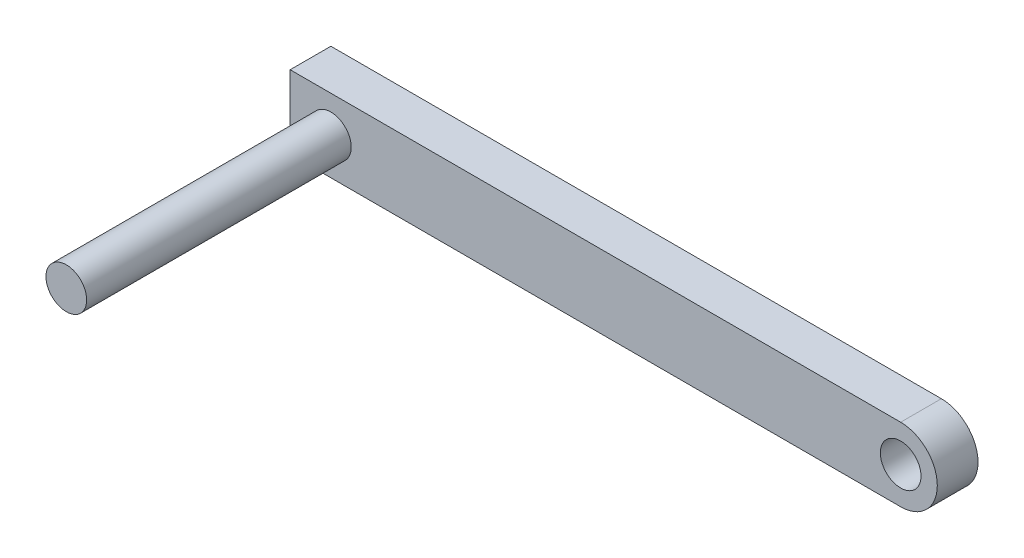
ISO-10303-21;
HEADER;
FILE_DESCRIPTION(('STEP AP214'),'2;1');
FILE_NAME('part.step','',(''),(''),'','','');
FILE_SCHEMA(('AUTOMOTIVE_DESIGN { 1 0 10303 214 1 1 1 1 }'));
ENDSEC;
DATA;
#1=APPLICATION_CONTEXT('core data for automotive mechanical design processes');
#2=APPLICATION_PROTOCOL_DEFINITION('international standard','automotive_design',2000,#1);
#3=PRODUCT_CONTEXT('',#1,'mechanical');
#4=PRODUCT('Part','Part','',(#3));
#5=PRODUCT_RELATED_PRODUCT_CATEGORY('part','',(#4));
#6=PRODUCT_DEFINITION_FORMATION('','',#4);
#7=PRODUCT_DEFINITION_CONTEXT('part definition',#1,'design');
#8=PRODUCT_DEFINITION('design','',#6,#7);
#9=PRODUCT_DEFINITION_SHAPE('','',#8);
#10=(LENGTH_UNIT() NAMED_UNIT(*) SI_UNIT(.MILLI.,.METRE.));
#11=(NAMED_UNIT(*) PLANE_ANGLE_UNIT() SI_UNIT($,.RADIAN.));
#12=(NAMED_UNIT(*) SI_UNIT($,.STERADIAN.) SOLID_ANGLE_UNIT());
#13=UNCERTAINTY_MEASURE_WITH_UNIT(LENGTH_MEASURE(1.E-05),#10,'distance_accuracy_value','');
#14=(GEOMETRIC_REPRESENTATION_CONTEXT(3) GLOBAL_UNCERTAINTY_ASSIGNED_CONTEXT((#13)) GLOBAL_UNIT_ASSIGNED_CONTEXT((#10,
#11,#12)) REPRESENTATION_CONTEXT('',''));
#15=CARTESIAN_POINT('',(0.,0.,0.));
#16=DIRECTION('',(0.,0.,1.));
#17=DIRECTION('',(1.,0.,0.));
#18=AXIS2_PLACEMENT_3D('',#15,#16,#17);
#19=CARTESIAN_POINT('',(300.,18.,20.));
#20=DIRECTION('',(0.,0.,1.));
#21=DIRECTION('',(1.,0.,0.));
#22=AXIS2_PLACEMENT_3D('',#19,#20,#21);
#23=PLANE('',#22);
#24=CARTESIAN_POINT('',(300.,18.,20.));
#25=DIRECTION('',(0.,0.,1.));
#26=DIRECTION('',(1.,0.,0.));
#27=AXIS2_PLACEMENT_3D('',#24,#25,#26);
#28=CIRCLE('',#27,10.);
#29=CARTESIAN_POINT('',(310.,18.,20.));
#30=VERTEX_POINT('',#29);
#31=EDGE_CURVE('E99',#30,#30,#28,.T.);
#32=ORIENTED_EDGE('',*,*,#31,.F.);
#33=EDGE_LOOP('',(#32));
#34=FACE_BOUND('',#33,.T.);
#35=DIRECTION('',(0.,-1.,0.));
#36=VECTOR('',#35,1.);
#37=CARTESIAN_POINT('',(0.,36.,20.));
#38=LINE('',#37,#36);
#39=CARTESIAN_POINT('',(0.,36.,20.));
#40=VERTEX_POINT('',#39);
#41=CARTESIAN_POINT('',(0.,0.,20.));
#42=VERTEX_POINT('',#41);
#43=EDGE_CURVE('E84',#40,#42,#38,.T.);
#44=ORIENTED_EDGE('',*,*,#43,.T.);
#45=DIRECTION('',(1.,0.,0.));
#46=VECTOR('',#45,1.);
#47=CARTESIAN_POINT('',(0.,0.,20.));
#48=LINE('',#47,#46);
#49=CARTESIAN_POINT('',(300.,0.,20.));
#50=VERTEX_POINT('',#49);
#51=EDGE_CURVE('E79',#42,#50,#48,.T.);
#52=ORIENTED_EDGE('',*,*,#51,.T.);
#53=CARTESIAN_POINT('',(300.,18.,20.));
#54=DIRECTION('',(0.,0.,1.));
#55=DIRECTION('',(1.,0.,0.));
#56=AXIS2_PLACEMENT_3D('',#53,#54,#55);
#57=CIRCLE('',#56,18.);
#58=CARTESIAN_POINT('',(300.,36.,20.));
#59=VERTEX_POINT('',#58);
#60=EDGE_CURVE('E82',#50,#59,#57,.T.);
#61=ORIENTED_EDGE('',*,*,#60,.T.);
#62=DIRECTION('',(-1.,0.,0.));
#63=VECTOR('',#62,1.);
#64=CARTESIAN_POINT('',(300.,36.,20.));
#65=LINE('',#64,#63);
#66=EDGE_CURVE('E49',#59,#40,#65,.T.);
#67=ORIENTED_EDGE('',*,*,#66,.T.);
#68=EDGE_LOOP('',(#44,#52,#61,#67));
#69=FACE_BOUND('',#68,.T.);
#70=CARTESIAN_POINT('',(20.,18.,20.));
#71=DIRECTION('',(0.,0.,1.));
#72=DIRECTION('',(1.,0.,0.));
#73=AXIS2_PLACEMENT_3D('',#70,#71,#72);
#74=CIRCLE('',#73,10.);
#75=CARTESIAN_POINT('',(30.,18.,20.));
#76=VERTEX_POINT('',#75);
#77=EDGE_CURVE('E117',#76,#76,#74,.T.);
#78=ORIENTED_EDGE('',*,*,#77,.F.);
#79=EDGE_LOOP('',(#78));
#80=FACE_BOUND('',#79,.T.);
#81=ADVANCED_FACE('F32',(#34,#69,#80),#23,.T.);
#82=CARTESIAN_POINT('',(300.,18.,0.));
#83=DIRECTION('',(0.,0.,1.));
#84=DIRECTION('',(1.,0.,0.));
#85=AXIS2_PLACEMENT_3D('',#82,#83,#84);
#86=PLANE('',#85);
#87=DIRECTION('',(0.,-1.,0.));
#88=VECTOR('',#87,1.);
#89=CARTESIAN_POINT('',(0.,36.,0.));
#90=LINE('',#89,#88);
#91=CARTESIAN_POINT('',(0.,36.,0.));
#92=VERTEX_POINT('',#91);
#93=CARTESIAN_POINT('',(0.,0.,0.));
#94=VERTEX_POINT('',#93);
#95=EDGE_CURVE('E96',#92,#94,#90,.T.);
#96=ORIENTED_EDGE('',*,*,#95,.F.);
#97=DIRECTION('',(-1.,0.,0.));
#98=VECTOR('',#97,1.);
#99=CARTESIAN_POINT('',(300.,36.,0.));
#100=LINE('',#99,#98);
#101=CARTESIAN_POINT('',(300.,36.,0.));
#102=VERTEX_POINT('',#101);
#103=EDGE_CURVE('E72',#102,#92,#100,.T.);
#104=ORIENTED_EDGE('',*,*,#103,.F.);
#105=CARTESIAN_POINT('',(300.,18.,0.));
#106=DIRECTION('',(0.,0.,1.));
#107=DIRECTION('',(1.,0.,0.));
#108=AXIS2_PLACEMENT_3D('',#105,#106,#107);
#109=CIRCLE('',#108,18.);
#110=CARTESIAN_POINT('',(300.,0.,0.));
#111=VERTEX_POINT('',#110);
#112=EDGE_CURVE('E66',#111,#102,#109,.T.);
#113=ORIENTED_EDGE('',*,*,#112,.F.);
#114=DIRECTION('',(1.,0.,0.));
#115=VECTOR('',#114,1.);
#116=CARTESIAN_POINT('',(0.,0.,0.));
#117=LINE('',#116,#115);
#118=EDGE_CURVE('E88',#94,#111,#117,.T.);
#119=ORIENTED_EDGE('',*,*,#118,.F.);
#120=EDGE_LOOP('',(#96,#104,#113,#119));
#121=FACE_BOUND('',#120,.T.);
#122=CARTESIAN_POINT('',(300.,18.,0.));
#123=DIRECTION('',(0.,0.,1.));
#124=DIRECTION('',(1.,0.,0.));
#125=AXIS2_PLACEMENT_3D('',#122,#123,#124);
#126=CIRCLE('',#125,10.);
#127=CARTESIAN_POINT('',(310.,18.,0.));
#128=VERTEX_POINT('',#127);
#129=EDGE_CURVE('E111',#128,#128,#126,.T.);
#130=ORIENTED_EDGE('',*,*,#129,.T.);
#131=EDGE_LOOP('',(#130));
#132=FACE_BOUND('',#131,.T.);
#133=ADVANCED_FACE('F107',(#121,#132),#86,.F.);
#134=CARTESIAN_POINT('',(0.,36.,20.));
#135=DIRECTION('',(1.,0.,0.));
#136=DIRECTION('',(0.,1.,0.));
#137=AXIS2_PLACEMENT_3D('',#134,#135,#136);
#138=PLANE('',#137);
#139=ORIENTED_EDGE('',*,*,#95,.T.);
#140=DIRECTION('',(0.,0.,-1.));
#141=VECTOR('',#140,1.);
#142=CARTESIAN_POINT('',(0.,0.,20.));
#143=LINE('',#142,#141);
#144=EDGE_CURVE('E11',#42,#94,#143,.T.);
#145=ORIENTED_EDGE('',*,*,#144,.F.);
#146=ORIENTED_EDGE('',*,*,#43,.F.);
#147=DIRECTION('',(0.,0.,-1.));
#148=VECTOR('',#147,1.);
#149=CARTESIAN_POINT('',(0.,36.,20.));
#150=LINE('',#149,#148);
#151=EDGE_CURVE('E92',#40,#92,#150,.T.);
#152=ORIENTED_EDGE('',*,*,#151,.T.);
#153=EDGE_LOOP('',(#139,#145,#146,#152));
#154=FACE_BOUND('',#153,.T.);
#155=ADVANCED_FACE('F34',(#154),#138,.F.);
#156=CARTESIAN_POINT('',(0.,0.,20.));
#157=DIRECTION('',(0.,1.,0.));
#158=DIRECTION('',(0.,0.,1.));
#159=AXIS2_PLACEMENT_3D('',#156,#157,#158);
#160=PLANE('',#159);
#161=ORIENTED_EDGE('',*,*,#118,.T.);
#162=DIRECTION('',(0.,0.,-1.));
#163=VECTOR('',#162,1.);
#164=CARTESIAN_POINT('',(300.,0.,20.));
#165=LINE('',#164,#163);
#166=EDGE_CURVE('E41',#50,#111,#165,.T.);
#167=ORIENTED_EDGE('',*,*,#166,.F.);
#168=ORIENTED_EDGE('',*,*,#51,.F.);
#169=ORIENTED_EDGE('',*,*,#144,.T.);
#170=EDGE_LOOP('',(#161,#167,#168,#169));
#171=FACE_BOUND('',#170,.T.);
#172=ADVANCED_FACE('F87',(#171),#160,.F.);
#173=CARTESIAN_POINT('',(300.,18.,20.));
#174=DIRECTION('',(0.,0.,-1.));
#175=DIRECTION('',(-1.,0.,0.));
#176=AXIS2_PLACEMENT_3D('',#173,#174,#175);
#177=CYLINDRICAL_SURFACE('',#176,18.);
#178=ORIENTED_EDGE('',*,*,#112,.T.);
#179=DIRECTION('',(0.,0.,-1.));
#180=VECTOR('',#179,1.);
#181=CARTESIAN_POINT('',(300.,36.,20.));
#182=LINE('',#181,#180);
#183=EDGE_CURVE('E89',#59,#102,#182,.T.);
#184=ORIENTED_EDGE('',*,*,#183,.F.);
#185=ORIENTED_EDGE('',*,*,#60,.F.);
#186=ORIENTED_EDGE('',*,*,#166,.T.);
#187=EDGE_LOOP('',(#178,#184,#185,#186));
#188=FACE_BOUND('',#187,.T.);
#189=ADVANCED_FACE('F90',(#188),#177,.T.);
#190=CARTESIAN_POINT('',(300.,36.,20.));
#191=DIRECTION('',(0.,-1.,0.));
#192=DIRECTION('',(1.,0.,0.));
#193=AXIS2_PLACEMENT_3D('',#190,#191,#192);
#194=PLANE('',#193);
#195=ORIENTED_EDGE('',*,*,#103,.T.);
#196=ORIENTED_EDGE('',*,*,#151,.F.);
#197=ORIENTED_EDGE('',*,*,#66,.F.);
#198=ORIENTED_EDGE('',*,*,#183,.T.);
#199=EDGE_LOOP('',(#195,#196,#197,#198));
#200=FACE_BOUND('',#199,.T.);
#201=ADVANCED_FACE('F104',(#200),#194,.F.);
#202=CARTESIAN_POINT('',(300.,18.,20.));
#203=DIRECTION('',(0.,0.,-1.));
#204=DIRECTION('',(-1.,0.,0.));
#205=AXIS2_PLACEMENT_3D('',#202,#203,#204);
#206=CYLINDRICAL_SURFACE('',#205,10.);
#207=ORIENTED_EDGE('',*,*,#31,.T.);
#208=EDGE_LOOP('',(#207));
#209=FACE_BOUND('',#208,.T.);
#210=ORIENTED_EDGE('',*,*,#129,.F.);
#211=EDGE_LOOP('',(#210));
#212=FACE_BOUND('',#211,.T.);
#213=ADVANCED_FACE('F128',(#209,#212),#206,.F.);
#214=CARTESIAN_POINT('',(20.,18.,150.));
#215=DIRECTION('',(0.,0.,-1.));
#216=DIRECTION('',(-1.,0.,0.));
#217=AXIS2_PLACEMENT_3D('',#214,#215,#216);
#218=CYLINDRICAL_SURFACE('',#217,10.);
#219=CARTESIAN_POINT('',(20.,18.,150.));
#220=DIRECTION('',(0.,0.,1.));
#221=DIRECTION('',(1.,0.,0.));
#222=AXIS2_PLACEMENT_3D('',#219,#220,#221);
#223=CIRCLE('',#222,10.);
#224=CARTESIAN_POINT('',(30.,18.,150.));
#225=VERTEX_POINT('',#224);
#226=EDGE_CURVE('E114',#225,#225,#223,.T.);
#227=ORIENTED_EDGE('',*,*,#226,.F.);
#228=EDGE_LOOP('',(#227));
#229=FACE_BOUND('',#228,.T.);
#230=ORIENTED_EDGE('',*,*,#77,.T.);
#231=EDGE_LOOP('',(#230));
#232=FACE_BOUND('',#231,.T.);
#233=ADVANCED_FACE('F125',(#229,#232),#218,.T.);
#234=CARTESIAN_POINT('',(20.,18.,150.));
#235=DIRECTION('',(0.,0.,1.));
#236=DIRECTION('',(1.,0.,0.));
#237=AXIS2_PLACEMENT_3D('',#234,#235,#236);
#238=PLANE('',#237);
#239=ORIENTED_EDGE('',*,*,#226,.T.);
#240=EDGE_LOOP('',(#239));
#241=FACE_BOUND('',#240,.T.);
#242=ADVANCED_FACE('F123',(#241),#238,.T.);
#243=CLOSED_SHELL('',(#81,#133,#155,#172,#189,#201,#213,#233,#242));
#244=MANIFOLD_SOLID_BREP('B2',#243);
#245=ADVANCED_BREP_SHAPE_REPRESENTATION('',(#18,#244),#14);
#246=SHAPE_DEFINITION_REPRESENTATION(#9,#245);
ENDSEC;
END-ISO-10303-21;
